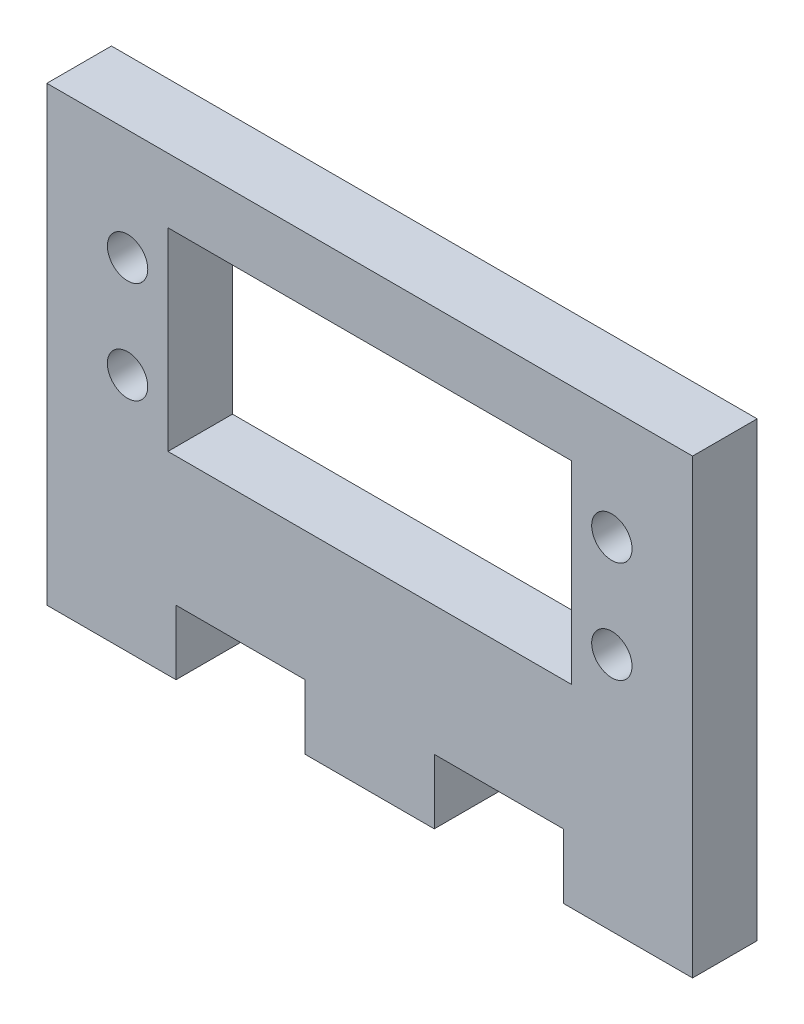
ISO-10303-21;
HEADER;
FILE_DESCRIPTION(('STEP AP214'),'2;1');
FILE_NAME('part.step','',(''),(''),'','','');
FILE_SCHEMA(('AUTOMOTIVE_DESIGN { 1 0 10303 214 1 1 1 1 }'));
ENDSEC;
DATA;
#1=APPLICATION_CONTEXT('core data for automotive mechanical design processes');
#2=APPLICATION_PROTOCOL_DEFINITION('international standard','automotive_design',2000,#1);
#3=PRODUCT_CONTEXT('',#1,'mechanical');
#4=PRODUCT('Part','Part','',(#3));
#5=PRODUCT_RELATED_PRODUCT_CATEGORY('part','',(#4));
#6=PRODUCT_DEFINITION_FORMATION('','',#4);
#7=PRODUCT_DEFINITION_CONTEXT('part definition',#1,'design');
#8=PRODUCT_DEFINITION('design','',#6,#7);
#9=PRODUCT_DEFINITION_SHAPE('','',#8);
#10=(LENGTH_UNIT() NAMED_UNIT(*) SI_UNIT(.MILLI.,.METRE.));
#11=(NAMED_UNIT(*) PLANE_ANGLE_UNIT() SI_UNIT($,.RADIAN.));
#12=(NAMED_UNIT(*) SI_UNIT($,.STERADIAN.) SOLID_ANGLE_UNIT());
#13=UNCERTAINTY_MEASURE_WITH_UNIT(LENGTH_MEASURE(1.E-05),#10,'distance_accuracy_value','');
#14=(GEOMETRIC_REPRESENTATION_CONTEXT(3) GLOBAL_UNCERTAINTY_ASSIGNED_CONTEXT((#13)) GLOBAL_UNIT_ASSIGNED_CONTEXT((#10,
#11,#12)) REPRESENTATION_CONTEXT('',''));
#15=CARTESIAN_POINT('',(0.,0.,0.));
#16=DIRECTION('',(0.,0.,1.));
#17=DIRECTION('',(1.,0.,0.));
#18=AXIS2_PLACEMENT_3D('',#15,#16,#17);
#19=CARTESIAN_POINT('',(0.,-12.7,6.35));
#20=DIRECTION('',(0.,1.,0.));
#21=DIRECTION('',(-1.,0.,0.));
#22=AXIS2_PLACEMENT_3D('',#19,#20,#21);
#23=PLANE('',#22);
#24=DIRECTION('',(1.,0.,0.));
#25=VECTOR('',#24,1.);
#26=CARTESIAN_POINT('',(0.,-12.7,0.));
#27=LINE('',#26,#25);
#28=CARTESIAN_POINT('',(26.19375,-12.7,0.));
#29=VERTEX_POINT('',#28);
#30=CARTESIAN_POINT('',(38.89375,-12.7,0.));
#31=VERTEX_POINT('',#30);
#32=EDGE_CURVE('E214',#29,#31,#27,.T.);
#33=ORIENTED_EDGE('',*,*,#32,.T.);
#34=DIRECTION('',(0.,0.,-1.));
#35=VECTOR('',#34,1.);
#36=CARTESIAN_POINT('',(38.89375,-12.7,6.35));
#37=LINE('',#36,#35);
#38=CARTESIAN_POINT('',(38.89375,-12.7,6.35));
#39=VERTEX_POINT('',#38);
#40=EDGE_CURVE('E11',#39,#31,#37,.T.);
#41=ORIENTED_EDGE('',*,*,#40,.F.);
#42=DIRECTION('',(1.,0.,0.));
#43=VECTOR('',#42,1.);
#44=CARTESIAN_POINT('',(0.,-12.7,6.35));
#45=LINE('',#44,#43);
#46=CARTESIAN_POINT('',(26.19375,-12.7,6.35));
#47=VERTEX_POINT('',#46);
#48=EDGE_CURVE('E288',#47,#39,#45,.T.);
#49=ORIENTED_EDGE('',*,*,#48,.F.);
#50=DIRECTION('',(0.,0.,-1.));
#51=VECTOR('',#50,1.);
#52=CARTESIAN_POINT('',(26.19375,-12.7,6.35));
#53=LINE('',#52,#51);
#54=EDGE_CURVE('E243',#47,#29,#53,.T.);
#55=ORIENTED_EDGE('',*,*,#54,.T.);
#56=EDGE_LOOP('',(#33,#41,#49,#55));
#57=FACE_BOUND('',#56,.T.);
#58=ADVANCED_FACE('F37',(#57),#23,.F.);
#59=CARTESIAN_POINT('',(38.89375,0.,6.35));
#60=DIRECTION('',(1.,0.,0.));
#61=DIRECTION('',(0.,1.,0.));
#62=AXIS2_PLACEMENT_3D('',#59,#60,#61);
#63=PLANE('',#62);
#64=DIRECTION('',(0.,-1.,0.));
#65=VECTOR('',#64,1.);
#66=CARTESIAN_POINT('',(38.89375,0.,0.));
#67=LINE('',#66,#65);
#68=CARTESIAN_POINT('',(38.89375,-19.05,0.));
#69=VERTEX_POINT('',#68);
#70=EDGE_CURVE('E217',#31,#69,#67,.T.);
#71=ORIENTED_EDGE('',*,*,#70,.T.);
#72=DIRECTION('',(0.,0.,-1.));
#73=VECTOR('',#72,1.);
#74=CARTESIAN_POINT('',(38.89375,-19.05,6.35));
#75=LINE('',#74,#73);
#76=CARTESIAN_POINT('',(38.89375,-19.05,6.35));
#77=VERTEX_POINT('',#76);
#78=EDGE_CURVE('E47',#77,#69,#75,.T.);
#79=ORIENTED_EDGE('',*,*,#78,.F.);
#80=DIRECTION('',(0.,-1.,0.));
#81=VECTOR('',#80,1.);
#82=CARTESIAN_POINT('',(38.89375,0.,6.35));
#83=LINE('',#82,#81);
#84=EDGE_CURVE('E296',#39,#77,#83,.T.);
#85=ORIENTED_EDGE('',*,*,#84,.F.);
#86=ORIENTED_EDGE('',*,*,#40,.T.);
#87=EDGE_LOOP('',(#71,#79,#85,#86));
#88=FACE_BOUND('',#87,.T.);
#89=ADVANCED_FACE('F332',(#88),#63,.F.);
#90=CARTESIAN_POINT('',(0.,-19.05,6.35));
#91=DIRECTION('',(0.,1.,0.));
#92=DIRECTION('',(0.,0.,1.));
#93=AXIS2_PLACEMENT_3D('',#90,#91,#92);
#94=PLANE('',#93);
#95=DIRECTION('',(1.,0.,0.));
#96=VECTOR('',#95,1.);
#97=CARTESIAN_POINT('',(0.,-19.05,0.));
#98=LINE('',#97,#96);
#99=CARTESIAN_POINT('',(51.59375,-19.05,0.));
#100=VERTEX_POINT('',#99);
#101=EDGE_CURVE('E219',#69,#100,#98,.T.);
#102=ORIENTED_EDGE('',*,*,#101,.T.);
#103=DIRECTION('',(0.,0.,-1.));
#104=VECTOR('',#103,1.);
#105=CARTESIAN_POINT('',(51.59375,-19.05,6.35));
#106=LINE('',#105,#104);
#107=CARTESIAN_POINT('',(51.59375,-19.05,6.35));
#108=VERTEX_POINT('',#107);
#109=EDGE_CURVE('E258',#108,#100,#106,.T.);
#110=ORIENTED_EDGE('',*,*,#109,.F.);
#111=DIRECTION('',(1.,0.,0.));
#112=VECTOR('',#111,1.);
#113=CARTESIAN_POINT('',(0.,-19.05,6.35));
#114=LINE('',#113,#112);
#115=EDGE_CURVE('E176',#77,#108,#114,.T.);
#116=ORIENTED_EDGE('',*,*,#115,.F.);
#117=ORIENTED_EDGE('',*,*,#78,.T.);
#118=EDGE_LOOP('',(#102,#110,#116,#117));
#119=FACE_BOUND('',#118,.T.);
#120=ADVANCED_FACE('F338',(#119),#94,.F.);
#121=CARTESIAN_POINT('',(51.59375,0.,6.35));
#122=DIRECTION('',(1.,0.,0.));
#123=DIRECTION('',(0.,1.,0.));
#124=AXIS2_PLACEMENT_3D('',#121,#122,#123);
#125=PLANE('',#124);
#126=DIRECTION('',(0.,-1.,0.));
#127=VECTOR('',#126,1.);
#128=CARTESIAN_POINT('',(51.59375,0.,0.));
#129=LINE('',#128,#127);
#130=CARTESIAN_POINT('',(51.59375,25.4,0.));
#131=VERTEX_POINT('',#130);
#132=EDGE_CURVE('E222',#131,#100,#129,.T.);
#133=ORIENTED_EDGE('',*,*,#132,.F.);
#134=DIRECTION('',(0.,0.,-1.));
#135=VECTOR('',#134,1.);
#136=CARTESIAN_POINT('',(51.59375,25.4,6.35));
#137=LINE('',#136,#135);
#138=CARTESIAN_POINT('',(51.59375,25.4,6.35));
#139=VERTEX_POINT('',#138);
#140=EDGE_CURVE('E256',#139,#131,#137,.T.);
#141=ORIENTED_EDGE('',*,*,#140,.F.);
#142=DIRECTION('',(0.,-1.,0.));
#143=VECTOR('',#142,1.);
#144=CARTESIAN_POINT('',(51.59375,0.,6.35));
#145=LINE('',#144,#143);
#146=EDGE_CURVE('E298',#139,#108,#145,.T.);
#147=ORIENTED_EDGE('',*,*,#146,.T.);
#148=ORIENTED_EDGE('',*,*,#109,.T.);
#149=EDGE_LOOP('',(#133,#141,#147,#148));
#150=FACE_BOUND('',#149,.T.);
#151=ADVANCED_FACE('F391',(#150),#125,.T.);
#152=CARTESIAN_POINT('',(0.,25.4,6.35));
#153=DIRECTION('',(0.,1.,0.));
#154=DIRECTION('',(0.,0.,1.));
#155=AXIS2_PLACEMENT_3D('',#152,#153,#154);
#156=PLANE('',#155);
#157=DIRECTION('',(1.,0.,0.));
#158=VECTOR('',#157,1.);
#159=CARTESIAN_POINT('',(0.,25.4,0.));
#160=LINE('',#159,#158);
#161=CARTESIAN_POINT('',(-11.90625,25.4,0.));
#162=VERTEX_POINT('',#161);
#163=EDGE_CURVE('E226',#162,#131,#160,.T.);
#164=ORIENTED_EDGE('',*,*,#163,.F.);
#165=DIRECTION('',(0.,0.,-1.));
#166=VECTOR('',#165,1.);
#167=CARTESIAN_POINT('',(-11.90625,25.4,6.35));
#168=LINE('',#167,#166);
#169=CARTESIAN_POINT('',(-11.90625,25.4,6.35));
#170=VERTEX_POINT('',#169);
#171=EDGE_CURVE('E254',#170,#162,#168,.T.);
#172=ORIENTED_EDGE('',*,*,#171,.F.);
#173=DIRECTION('',(1.,0.,0.));
#174=VECTOR('',#173,1.);
#175=CARTESIAN_POINT('',(0.,25.4,6.35));
#176=LINE('',#175,#174);
#177=EDGE_CURVE('E301',#170,#139,#176,.T.);
#178=ORIENTED_EDGE('',*,*,#177,.T.);
#179=ORIENTED_EDGE('',*,*,#140,.T.);
#180=EDGE_LOOP('',(#164,#172,#178,#179));
#181=FACE_BOUND('',#180,.T.);
#182=ADVANCED_FACE('F398',(#181),#156,.T.);
#183=CARTESIAN_POINT('',(-11.90625,0.,6.35));
#184=DIRECTION('',(1.,0.,0.));
#185=DIRECTION('',(0.,1.,0.));
#186=AXIS2_PLACEMENT_3D('',#183,#184,#185);
#187=PLANE('',#186);
#188=DIRECTION('',(0.,-1.,0.));
#189=VECTOR('',#188,1.);
#190=CARTESIAN_POINT('',(-11.90625,0.,0.));
#191=LINE('',#190,#189);
#192=CARTESIAN_POINT('',(-11.90625,-19.05,0.));
#193=VERTEX_POINT('',#192);
#194=EDGE_CURVE('E229',#162,#193,#191,.T.);
#195=ORIENTED_EDGE('',*,*,#194,.T.);
#196=DIRECTION('',(0.,0.,-1.));
#197=VECTOR('',#196,1.);
#198=CARTESIAN_POINT('',(-11.90625,-19.05,6.35));
#199=LINE('',#198,#197);
#200=CARTESIAN_POINT('',(-11.90625,-19.05,6.35));
#201=VERTEX_POINT('',#200);
#202=EDGE_CURVE('E251',#201,#193,#199,.T.);
#203=ORIENTED_EDGE('',*,*,#202,.F.);
#204=DIRECTION('',(0.,-1.,0.));
#205=VECTOR('',#204,1.);
#206=CARTESIAN_POINT('',(-11.90625,0.,6.35));
#207=LINE('',#206,#205);
#208=EDGE_CURVE('E304',#170,#201,#207,.T.);
#209=ORIENTED_EDGE('',*,*,#208,.F.);
#210=ORIENTED_EDGE('',*,*,#171,.T.);
#211=EDGE_LOOP('',(#195,#203,#209,#210));
#212=FACE_BOUND('',#211,.T.);
#213=ADVANCED_FACE('F394',(#212),#187,.F.);
#214=CARTESIAN_POINT('',(0.793749999999993,-19.05,0.));
#215=VERTEX_POINT('',#214);
#216=EDGE_CURVE('E223',#193,#215,#98,.T.);
#217=ORIENTED_EDGE('',*,*,#216,.T.);
#218=DIRECTION('',(0.,0.,-1.));
#219=VECTOR('',#218,1.);
#220=CARTESIAN_POINT('',(0.793749999999993,-19.05,6.35));
#221=LINE('',#220,#219);
#222=CARTESIAN_POINT('',(0.793749999999993,-19.05,6.35));
#223=VERTEX_POINT('',#222);
#224=EDGE_CURVE('E249',#223,#215,#221,.T.);
#225=ORIENTED_EDGE('',*,*,#224,.F.);
#226=EDGE_CURVE('E175',#201,#223,#114,.T.);
#227=ORIENTED_EDGE('',*,*,#226,.F.);
#228=ORIENTED_EDGE('',*,*,#202,.T.);
#229=EDGE_LOOP('',(#217,#225,#227,#228));
#230=FACE_BOUND('',#229,.T.);
#231=ADVANCED_FACE('F314',(#230),#94,.F.);
#232=CARTESIAN_POINT('',(0.793749999999991,0.,6.35));
#233=DIRECTION('',(1.,0.,0.));
#234=DIRECTION('',(0.,1.,0.));
#235=AXIS2_PLACEMENT_3D('',#232,#233,#234);
#236=PLANE('',#235);
#237=DIRECTION('',(0.,-1.,0.));
#238=VECTOR('',#237,1.);
#239=CARTESIAN_POINT('',(0.793749999999991,0.,0.));
#240=LINE('',#239,#238);
#241=CARTESIAN_POINT('',(0.793749999999992,-12.7,0.));
#242=VERTEX_POINT('',#241);
#243=EDGE_CURVE('E231',#242,#215,#240,.T.);
#244=ORIENTED_EDGE('',*,*,#243,.F.);
#245=DIRECTION('',(0.,0.,-1.));
#246=VECTOR('',#245,1.);
#247=CARTESIAN_POINT('',(0.793749999999992,-12.7,6.35));
#248=LINE('',#247,#246);
#249=CARTESIAN_POINT('',(0.793749999999992,-12.7,6.35));
#250=VERTEX_POINT('',#249);
#251=EDGE_CURVE('E247',#250,#242,#248,.T.);
#252=ORIENTED_EDGE('',*,*,#251,.F.);
#253=DIRECTION('',(0.,-1.,0.));
#254=VECTOR('',#253,1.);
#255=CARTESIAN_POINT('',(0.793749999999991,0.,6.35));
#256=LINE('',#255,#254);
#257=EDGE_CURVE('E184',#250,#223,#256,.T.);
#258=ORIENTED_EDGE('',*,*,#257,.T.);
#259=ORIENTED_EDGE('',*,*,#224,.T.);
#260=EDGE_LOOP('',(#244,#252,#258,#259));
#261=FACE_BOUND('',#260,.T.);
#262=ADVANCED_FACE('F317',(#261),#236,.T.);
#263=CARTESIAN_POINT('',(0.,-12.7,6.35));
#264=DIRECTION('',(0.,-1.,0.));
#265=DIRECTION('',(1.,0.,0.));
#266=AXIS2_PLACEMENT_3D('',#263,#264,#265);
#267=PLANE('',#266);
#268=DIRECTION('',(-1.,0.,0.));
#269=VECTOR('',#268,1.);
#270=CARTESIAN_POINT('',(0.,-12.7,0.));
#271=LINE('',#270,#269);
#272=CARTESIAN_POINT('',(13.49375,-12.7,0.));
#273=VERTEX_POINT('',#272);
#274=EDGE_CURVE('E234',#273,#242,#271,.T.);
#275=ORIENTED_EDGE('',*,*,#274,.F.);
#276=DIRECTION('',(0.,0.,-1.));
#277=VECTOR('',#276,1.);
#278=CARTESIAN_POINT('',(13.49375,-12.7,6.35));
#279=LINE('',#278,#277);
#280=CARTESIAN_POINT('',(13.49375,-12.7,6.35));
#281=VERTEX_POINT('',#280);
#282=EDGE_CURVE('E169',#281,#273,#279,.T.);
#283=ORIENTED_EDGE('',*,*,#282,.F.);
#284=DIRECTION('',(-1.,0.,0.));
#285=VECTOR('',#284,1.);
#286=CARTESIAN_POINT('',(0.,-12.7,6.35));
#287=LINE('',#286,#285);
#288=EDGE_CURVE('E182',#281,#250,#287,.T.);
#289=ORIENTED_EDGE('',*,*,#288,.T.);
#290=ORIENTED_EDGE('',*,*,#251,.T.);
#291=EDGE_LOOP('',(#275,#283,#289,#290));
#292=FACE_BOUND('',#291,.T.);
#293=ADVANCED_FACE('F322',(#292),#267,.T.);
#294=CARTESIAN_POINT('',(13.49375,0.,6.35));
#295=DIRECTION('',(-1.,0.,0.));
#296=DIRECTION('',(0.,-1.,0.));
#297=AXIS2_PLACEMENT_3D('',#294,#295,#296);
#298=PLANE('',#297);
#299=DIRECTION('',(0.,1.,0.));
#300=VECTOR('',#299,1.);
#301=CARTESIAN_POINT('',(13.49375,0.,0.));
#302=LINE('',#301,#300);
#303=CARTESIAN_POINT('',(13.49375,-19.05,0.));
#304=VERTEX_POINT('',#303);
#305=EDGE_CURVE('E168',#304,#273,#302,.T.);
#306=ORIENTED_EDGE('',*,*,#305,.F.);
#307=DIRECTION('',(0.,0.,-1.));
#308=VECTOR('',#307,1.);
#309=CARTESIAN_POINT('',(13.49375,-19.05,6.35));
#310=LINE('',#309,#308);
#311=CARTESIAN_POINT('',(13.49375,-19.05,6.35));
#312=VERTEX_POINT('',#311);
#313=EDGE_CURVE('E162',#312,#304,#310,.T.);
#314=ORIENTED_EDGE('',*,*,#313,.F.);
#315=DIRECTION('',(0.,1.,0.));
#316=VECTOR('',#315,1.);
#317=CARTESIAN_POINT('',(13.49375,0.,6.35));
#318=LINE('',#317,#316);
#319=EDGE_CURVE('E166',#312,#281,#318,.T.);
#320=ORIENTED_EDGE('',*,*,#319,.T.);
#321=ORIENTED_EDGE('',*,*,#282,.T.);
#322=EDGE_LOOP('',(#306,#314,#320,#321));
#323=FACE_BOUND('',#322,.T.);
#324=ADVANCED_FACE('F164',(#323),#298,.T.);
#325=CARTESIAN_POINT('',(26.19375,-19.05,0.));
#326=VERTEX_POINT('',#325);
#327=EDGE_CURVE('E108',#304,#326,#98,.T.);
#328=ORIENTED_EDGE('',*,*,#327,.T.);
#329=DIRECTION('',(0.,0.,-1.));
#330=VECTOR('',#329,1.);
#331=CARTESIAN_POINT('',(26.19375,-19.05,6.35));
#332=LINE('',#331,#330);
#333=CARTESIAN_POINT('',(26.19375,-19.05,6.35));
#334=VERTEX_POINT('',#333);
#335=EDGE_CURVE('E170',#334,#326,#332,.T.);
#336=ORIENTED_EDGE('',*,*,#335,.F.);
#337=EDGE_CURVE('E172',#312,#334,#114,.T.);
#338=ORIENTED_EDGE('',*,*,#337,.F.);
#339=ORIENTED_EDGE('',*,*,#313,.T.);
#340=EDGE_LOOP('',(#328,#336,#338,#339));
#341=FACE_BOUND('',#340,.T.);
#342=ADVANCED_FACE('F173',(#341),#94,.F.);
#343=CARTESIAN_POINT('',(39.6875,0.,6.35));
#344=DIRECTION('',(-1.,0.,0.));
#345=DIRECTION('',(0.,0.,1.));
#346=AXIS2_PLACEMENT_3D('',#343,#344,#345);
#347=PLANE('',#346);
#348=DIRECTION('',(0.,1.,0.));
#349=VECTOR('',#348,1.);
#350=CARTESIAN_POINT('',(39.6875,0.,0.));
#351=LINE('',#350,#349);
#352=CARTESIAN_POINT('',(39.6875,0.,0.));
#353=VERTEX_POINT('',#352);
#354=CARTESIAN_POINT('',(39.6875,19.05,0.));
#355=VERTEX_POINT('',#354);
#356=EDGE_CURVE('E202',#353,#355,#351,.T.);
#357=ORIENTED_EDGE('',*,*,#356,.F.);
#358=DIRECTION('',(0.,0.,-1.));
#359=VECTOR('',#358,1.);
#360=CARTESIAN_POINT('',(39.6875,0.,6.35));
#361=LINE('',#360,#359);
#362=CARTESIAN_POINT('',(39.6875,0.,6.35));
#363=VERTEX_POINT('',#362);
#364=EDGE_CURVE('E41',#363,#353,#361,.T.);
#365=ORIENTED_EDGE('',*,*,#364,.F.);
#366=DIRECTION('',(0.,1.,0.));
#367=VECTOR('',#366,1.);
#368=CARTESIAN_POINT('',(39.6875,0.,6.35));
#369=LINE('',#368,#367);
#370=CARTESIAN_POINT('',(39.6875,19.05,6.35));
#371=VERTEX_POINT('',#370);
#372=EDGE_CURVE('E291',#363,#371,#369,.T.);
#373=ORIENTED_EDGE('',*,*,#372,.T.);
#374=DIRECTION('',(0.,0.,-1.));
#375=VECTOR('',#374,1.);
#376=CARTESIAN_POINT('',(39.6875,19.05,6.35));
#377=LINE('',#376,#375);
#378=EDGE_CURVE('E192',#371,#355,#377,.T.);
#379=ORIENTED_EDGE('',*,*,#378,.T.);
#380=EDGE_LOOP('',(#357,#365,#373,#379));
#381=FACE_BOUND('',#380,.T.);
#382=ADVANCED_FACE('F275',(#381),#347,.T.);
#383=CARTESIAN_POINT('',(0.,0.,6.35));
#384=DIRECTION('',(0.,1.,0.));
#385=DIRECTION('',(0.,0.,1.));
#386=AXIS2_PLACEMENT_3D('',#383,#384,#385);
#387=PLANE('',#386);
#388=DIRECTION('',(1.,0.,0.));
#389=VECTOR('',#388,1.);
#390=CARTESIAN_POINT('',(0.,0.,0.));
#391=LINE('',#390,#389);
#392=CARTESIAN_POINT('',(0.,0.,0.));
#393=VERTEX_POINT('',#392);
#394=EDGE_CURVE('E205',#393,#353,#391,.T.);
#395=ORIENTED_EDGE('',*,*,#394,.F.);
#396=DIRECTION('',(0.,0.,-1.));
#397=VECTOR('',#396,1.);
#398=CARTESIAN_POINT('',(0.,0.,6.35));
#399=LINE('',#398,#397);
#400=CARTESIAN_POINT('',(0.,0.,6.35));
#401=VERTEX_POINT('',#400);
#402=EDGE_CURVE('E265',#401,#393,#399,.T.);
#403=ORIENTED_EDGE('',*,*,#402,.F.);
#404=DIRECTION('',(1.,0.,0.));
#405=VECTOR('',#404,1.);
#406=CARTESIAN_POINT('',(0.,0.,6.35));
#407=LINE('',#406,#405);
#408=EDGE_CURVE('E274',#401,#363,#407,.T.);
#409=ORIENTED_EDGE('',*,*,#408,.T.);
#410=ORIENTED_EDGE('',*,*,#364,.T.);
#411=EDGE_LOOP('',(#395,#403,#409,#410));
#412=FACE_BOUND('',#411,.T.);
#413=ADVANCED_FACE('F272',(#412),#387,.T.);
#414=CARTESIAN_POINT('',(0.,0.,6.35));
#415=DIRECTION('',(-1.,0.,0.));
#416=DIRECTION('',(0.,0.,1.));
#417=AXIS2_PLACEMENT_3D('',#414,#415,#416);
#418=PLANE('',#417);
#419=DIRECTION('',(0.,1.,0.));
#420=VECTOR('',#419,1.);
#421=CARTESIAN_POINT('',(0.,0.,0.));
#422=LINE('',#421,#420);
#423=CARTESIAN_POINT('',(0.,19.05,0.));
#424=VERTEX_POINT('',#423);
#425=EDGE_CURVE('E208',#393,#424,#422,.T.);
#426=ORIENTED_EDGE('',*,*,#425,.T.);
#427=DIRECTION('',(0.,0.,-1.));
#428=VECTOR('',#427,1.);
#429=CARTESIAN_POINT('',(0.,19.05,6.35));
#430=LINE('',#429,#428);
#431=CARTESIAN_POINT('',(0.,19.05,6.35));
#432=VERTEX_POINT('',#431);
#433=EDGE_CURVE('E263',#432,#424,#430,.T.);
#434=ORIENTED_EDGE('',*,*,#433,.F.);
#435=DIRECTION('',(0.,1.,0.));
#436=VECTOR('',#435,1.);
#437=CARTESIAN_POINT('',(0.,0.,6.35));
#438=LINE('',#437,#436);
#439=EDGE_CURVE('E283',#401,#432,#438,.T.);
#440=ORIENTED_EDGE('',*,*,#439,.F.);
#441=ORIENTED_EDGE('',*,*,#402,.T.);
#442=EDGE_LOOP('',(#426,#434,#440,#441));
#443=FACE_BOUND('',#442,.T.);
#444=ADVANCED_FACE('F281',(#443),#418,.F.);
#445=CARTESIAN_POINT('',(26.19375,0.,6.35));
#446=DIRECTION('',(-1.,0.,0.));
#447=DIRECTION('',(0.,0.,1.));
#448=AXIS2_PLACEMENT_3D('',#445,#446,#447);
#449=PLANE('',#448);
#450=DIRECTION('',(0.,1.,0.));
#451=VECTOR('',#450,1.);
#452=CARTESIAN_POINT('',(26.19375,0.,0.));
#453=LINE('',#452,#451);
#454=EDGE_CURVE('E114',#326,#29,#453,.T.);
#455=ORIENTED_EDGE('',*,*,#454,.T.);
#456=ORIENTED_EDGE('',*,*,#54,.F.);
#457=DIRECTION('',(0.,1.,0.));
#458=VECTOR('',#457,1.);
#459=CARTESIAN_POINT('',(26.19375,0.,6.35));
#460=LINE('',#459,#458);
#461=EDGE_CURVE('E56',#334,#47,#460,.T.);
#462=ORIENTED_EDGE('',*,*,#461,.F.);
#463=ORIENTED_EDGE('',*,*,#335,.T.);
#464=EDGE_LOOP('',(#455,#456,#462,#463));
#465=FACE_BOUND('',#464,.T.);
#466=ADVANCED_FACE('F346',(#465),#449,.F.);
#467=CARTESIAN_POINT('',(0.,19.05,6.35));
#468=DIRECTION('',(0.,1.,0.));
#469=DIRECTION('',(0.,0.,1.));
#470=AXIS2_PLACEMENT_3D('',#467,#468,#469);
#471=PLANE('',#470);
#472=DIRECTION('',(1.,0.,0.));
#473=VECTOR('',#472,1.);
#474=CARTESIAN_POINT('',(0.,19.05,0.));
#475=LINE('',#474,#473);
#476=EDGE_CURVE('E211',#424,#355,#475,.T.);
#477=ORIENTED_EDGE('',*,*,#476,.T.);
#478=ORIENTED_EDGE('',*,*,#378,.F.);
#479=DIRECTION('',(1.,0.,0.));
#480=VECTOR('',#479,1.);
#481=CARTESIAN_POINT('',(0.,19.05,6.35));
#482=LINE('',#481,#480);
#483=EDGE_CURVE('E286',#432,#371,#482,.T.);
#484=ORIENTED_EDGE('',*,*,#483,.F.);
#485=ORIENTED_EDGE('',*,*,#433,.T.);
#486=EDGE_LOOP('',(#477,#478,#484,#485));
#487=FACE_BOUND('',#486,.T.);
#488=ADVANCED_FACE('F285',(#487),#471,.F.);
#489=CARTESIAN_POINT('',(43.65625,14.525,6.35));
#490=DIRECTION('',(0.,0.,-1.));
#491=DIRECTION('',(-1.,0.,0.));
#492=AXIS2_PLACEMENT_3D('',#489,#490,#491);
#493=CYLINDRICAL_SURFACE('',#492,1.98437499999999);
#494=CARTESIAN_POINT('',(43.65625,14.525,6.35));
#495=DIRECTION('',(0.,0.,1.));
#496=DIRECTION('',(1.,0.,0.));
#497=AXIS2_PLACEMENT_3D('',#494,#495,#496);
#498=CIRCLE('',#497,1.98437499999999);
#499=CARTESIAN_POINT('',(45.640625,14.525,6.35));
#500=VERTEX_POINT('',#499);
#501=EDGE_CURVE('E549',#500,#500,#498,.T.);
#502=ORIENTED_EDGE('',*,*,#501,.T.);
#503=EDGE_LOOP('',(#502));
#504=FACE_BOUND('',#503,.T.);
#505=CARTESIAN_POINT('',(43.65625,14.525,0.));
#506=DIRECTION('',(0.,0.,1.));
#507=DIRECTION('',(1.,0.,0.));
#508=AXIS2_PLACEMENT_3D('',#505,#506,#507);
#509=CIRCLE('',#508,1.98437499999999);
#510=CARTESIAN_POINT('',(45.640625,14.525,0.));
#511=VERTEX_POINT('',#510);
#512=EDGE_CURVE('E199',#511,#511,#509,.T.);
#513=ORIENTED_EDGE('',*,*,#512,.F.);
#514=EDGE_LOOP('',(#513));
#515=FACE_BOUND('',#514,.T.);
#516=ADVANCED_FACE('F345',(#504,#515),#493,.F.);
#517=CARTESIAN_POINT('',(43.65625,4.525,6.35));
#518=DIRECTION('',(0.,0.,-1.));
#519=DIRECTION('',(-1.,0.,0.));
#520=AXIS2_PLACEMENT_3D('',#517,#518,#519);
#521=CYLINDRICAL_SURFACE('',#520,1.984375);
#522=CARTESIAN_POINT('',(43.65625,4.525,6.35));
#523=DIRECTION('',(0.,0.,1.));
#524=DIRECTION('',(1.,0.,0.));
#525=AXIS2_PLACEMENT_3D('',#522,#523,#524);
#526=CIRCLE('',#525,1.984375);
#527=CARTESIAN_POINT('',(45.640625,4.525,6.35));
#528=VERTEX_POINT('',#527);
#529=EDGE_CURVE('E366',#528,#528,#526,.T.);
#530=ORIENTED_EDGE('',*,*,#529,.T.);
#531=EDGE_LOOP('',(#530));
#532=FACE_BOUND('',#531,.T.);
#533=CARTESIAN_POINT('',(43.65625,4.525,0.));
#534=DIRECTION('',(0.,0.,1.));
#535=DIRECTION('',(1.,0.,0.));
#536=AXIS2_PLACEMENT_3D('',#533,#534,#535);
#537=CIRCLE('',#536,1.984375);
#538=CARTESIAN_POINT('',(45.640625,4.525,0.));
#539=VERTEX_POINT('',#538);
#540=EDGE_CURVE('E196',#539,#539,#537,.T.);
#541=ORIENTED_EDGE('',*,*,#540,.F.);
#542=EDGE_LOOP('',(#541));
#543=FACE_BOUND('',#542,.T.);
#544=ADVANCED_FACE('F354',(#532,#543),#521,.F.);
#545=CARTESIAN_POINT('',(-3.96875000000001,4.52500000000001,6.35));
#546=DIRECTION('',(0.,0.,-1.));
#547=DIRECTION('',(-1.,0.,0.));
#548=AXIS2_PLACEMENT_3D('',#545,#546,#547);
#549=CYLINDRICAL_SURFACE('',#548,1.984375);
#550=CARTESIAN_POINT('',(-3.96875000000001,4.52500000000001,6.35));
#551=DIRECTION('',(0.,0.,1.));
#552=DIRECTION('',(1.,0.,0.));
#553=AXIS2_PLACEMENT_3D('',#550,#551,#552);
#554=CIRCLE('',#553,1.984375);
#555=CARTESIAN_POINT('',(-1.98437500000002,4.52500000000001,6.35));
#556=VERTEX_POINT('',#555);
#557=EDGE_CURVE('E242',#556,#556,#554,.F.);
#558=ORIENTED_EDGE('',*,*,#557,.F.);
#559=EDGE_LOOP('',(#558));
#560=FACE_BOUND('',#559,.T.);
#561=CARTESIAN_POINT('',(-3.96875000000001,4.52500000000001,0.));
#562=DIRECTION('',(0.,0.,1.));
#563=DIRECTION('',(1.,0.,0.));
#564=AXIS2_PLACEMENT_3D('',#561,#562,#563);
#565=CIRCLE('',#564,1.984375);
#566=CARTESIAN_POINT('',(-1.98437500000002,4.52500000000001,0.));
#567=VERTEX_POINT('',#566);
#568=EDGE_CURVE('E193',#567,#567,#565,.F.);
#569=ORIENTED_EDGE('',*,*,#568,.T.);
#570=EDGE_LOOP('',(#569));
#571=FACE_BOUND('',#570,.T.);
#572=ADVANCED_FACE('F39',(#560,#571),#549,.F.);
#573=CARTESIAN_POINT('',(-3.96875000000001,14.525,6.35));
#574=DIRECTION('',(0.,0.,-1.));
#575=DIRECTION('',(-1.,0.,0.));
#576=AXIS2_PLACEMENT_3D('',#573,#574,#575);
#577=CYLINDRICAL_SURFACE('',#576,1.98437499999999);
#578=CARTESIAN_POINT('',(-3.96875000000001,14.525,6.35));
#579=DIRECTION('',(0.,0.,1.));
#580=DIRECTION('',(1.,0.,0.));
#581=AXIS2_PLACEMENT_3D('',#578,#579,#580);
#582=CIRCLE('',#581,1.98437499999999);
#583=CARTESIAN_POINT('',(-1.98437500000002,14.525,6.35));
#584=VERTEX_POINT('',#583);
#585=EDGE_CURVE('E189',#584,#584,#582,.F.);
#586=ORIENTED_EDGE('',*,*,#585,.F.);
#587=EDGE_LOOP('',(#586));
#588=FACE_BOUND('',#587,.T.);
#589=CARTESIAN_POINT('',(-3.96875000000001,14.525,0.));
#590=DIRECTION('',(0.,0.,1.));
#591=DIRECTION('',(1.,0.,0.));
#592=AXIS2_PLACEMENT_3D('',#589,#590,#591);
#593=CIRCLE('',#592,1.98437499999999);
#594=CARTESIAN_POINT('',(-1.98437500000002,14.525,0.));
#595=VERTEX_POINT('',#594);
#596=EDGE_CURVE('E239',#595,#595,#593,.F.);
#597=ORIENTED_EDGE('',*,*,#596,.T.);
#598=EDGE_LOOP('',(#597));
#599=FACE_BOUND('',#598,.T.);
#600=ADVANCED_FACE('F361',(#588,#599),#577,.F.);
#601=CARTESIAN_POINT('',(0.,0.,6.35));
#602=DIRECTION('',(0.,0.,1.));
#603=DIRECTION('',(1.,0.,0.));
#604=AXIS2_PLACEMENT_3D('',#601,#602,#603);
#605=PLANE('',#604);
#606=ORIENTED_EDGE('',*,*,#557,.T.);
#607=EDGE_LOOP('',(#606));
#608=FACE_BOUND('',#607,.T.);
#609=ORIENTED_EDGE('',*,*,#529,.F.);
#610=EDGE_LOOP('',(#609));
#611=FACE_BOUND('',#610,.T.);
#612=ORIENTED_EDGE('',*,*,#501,.F.);
#613=EDGE_LOOP('',(#612));
#614=FACE_BOUND('',#613,.T.);
#615=ORIENTED_EDGE('',*,*,#372,.F.);
#616=ORIENTED_EDGE('',*,*,#408,.F.);
#617=ORIENTED_EDGE('',*,*,#439,.T.);
#618=ORIENTED_EDGE('',*,*,#483,.T.);
#619=EDGE_LOOP('',(#615,#616,#617,#618));
#620=FACE_BOUND('',#619,.T.);
#621=ORIENTED_EDGE('',*,*,#48,.T.);
#622=ORIENTED_EDGE('',*,*,#84,.T.);
#623=ORIENTED_EDGE('',*,*,#115,.T.);
#624=ORIENTED_EDGE('',*,*,#146,.F.);
#625=ORIENTED_EDGE('',*,*,#177,.F.);
#626=ORIENTED_EDGE('',*,*,#208,.T.);
#627=ORIENTED_EDGE('',*,*,#226,.T.);
#628=ORIENTED_EDGE('',*,*,#257,.F.);
#629=ORIENTED_EDGE('',*,*,#288,.F.);
#630=ORIENTED_EDGE('',*,*,#319,.F.);
#631=ORIENTED_EDGE('',*,*,#337,.T.);
#632=ORIENTED_EDGE('',*,*,#461,.T.);
#633=EDGE_LOOP('',(#621,#622,#623,#624,#625,#626,#627,#628,#629,#630,#631,#632));
#634=FACE_BOUND('',#633,.T.);
#635=ORIENTED_EDGE('',*,*,#585,.T.);
#636=EDGE_LOOP('',(#635));
#637=FACE_BOUND('',#636,.T.);
#638=ADVANCED_FACE('F178',(#608,#611,#614,#620,#634,#637),#605,.T.);
#639=CARTESIAN_POINT('',(0.,0.,0.));
#640=DIRECTION('',(0.,0.,1.));
#641=DIRECTION('',(1.,0.,0.));
#642=AXIS2_PLACEMENT_3D('',#639,#640,#641);
#643=PLANE('',#642);
#644=ORIENTED_EDGE('',*,*,#568,.F.);
#645=EDGE_LOOP('',(#644));
#646=FACE_BOUND('',#645,.T.);
#647=ORIENTED_EDGE('',*,*,#540,.T.);
#648=EDGE_LOOP('',(#647));
#649=FACE_BOUND('',#648,.T.);
#650=ORIENTED_EDGE('',*,*,#512,.T.);
#651=EDGE_LOOP('',(#650));
#652=FACE_BOUND('',#651,.T.);
#653=ORIENTED_EDGE('',*,*,#356,.T.);
#654=ORIENTED_EDGE('',*,*,#476,.F.);
#655=ORIENTED_EDGE('',*,*,#425,.F.);
#656=ORIENTED_EDGE('',*,*,#394,.T.);
#657=EDGE_LOOP('',(#653,#654,#655,#656));
#658=FACE_BOUND('',#657,.T.);
#659=ORIENTED_EDGE('',*,*,#32,.F.);
#660=ORIENTED_EDGE('',*,*,#454,.F.);
#661=ORIENTED_EDGE('',*,*,#327,.F.);
#662=ORIENTED_EDGE('',*,*,#305,.T.);
#663=ORIENTED_EDGE('',*,*,#274,.T.);
#664=ORIENTED_EDGE('',*,*,#243,.T.);
#665=ORIENTED_EDGE('',*,*,#216,.F.);
#666=ORIENTED_EDGE('',*,*,#194,.F.);
#667=ORIENTED_EDGE('',*,*,#163,.T.);
#668=ORIENTED_EDGE('',*,*,#132,.T.);
#669=ORIENTED_EDGE('',*,*,#101,.F.);
#670=ORIENTED_EDGE('',*,*,#70,.F.);
#671=EDGE_LOOP('',(#659,#660,#661,#662,#663,#664,#665,#666,#667,#668,#669,#670));
#672=FACE_BOUND('',#671,.T.);
#673=ORIENTED_EDGE('',*,*,#596,.F.);
#674=EDGE_LOOP('',(#673));
#675=FACE_BOUND('',#674,.T.);
#676=ADVANCED_FACE('F278',(#646,#649,#652,#658,#672,#675),#643,.F.);
#677=CLOSED_SHELL('',(#58,#89,#120,#151,#182,#213,#231,#262,#293,#324,#342,#382,#413,#444,#466,
#488,#516,#544,#572,#600,#638,#676));
#678=MANIFOLD_SOLID_BREP('B2',#677);
#679=ADVANCED_BREP_SHAPE_REPRESENTATION('',(#18,#678),#14);
#680=SHAPE_DEFINITION_REPRESENTATION(#9,#679);
ENDSEC;
END-ISO-10303-21;
